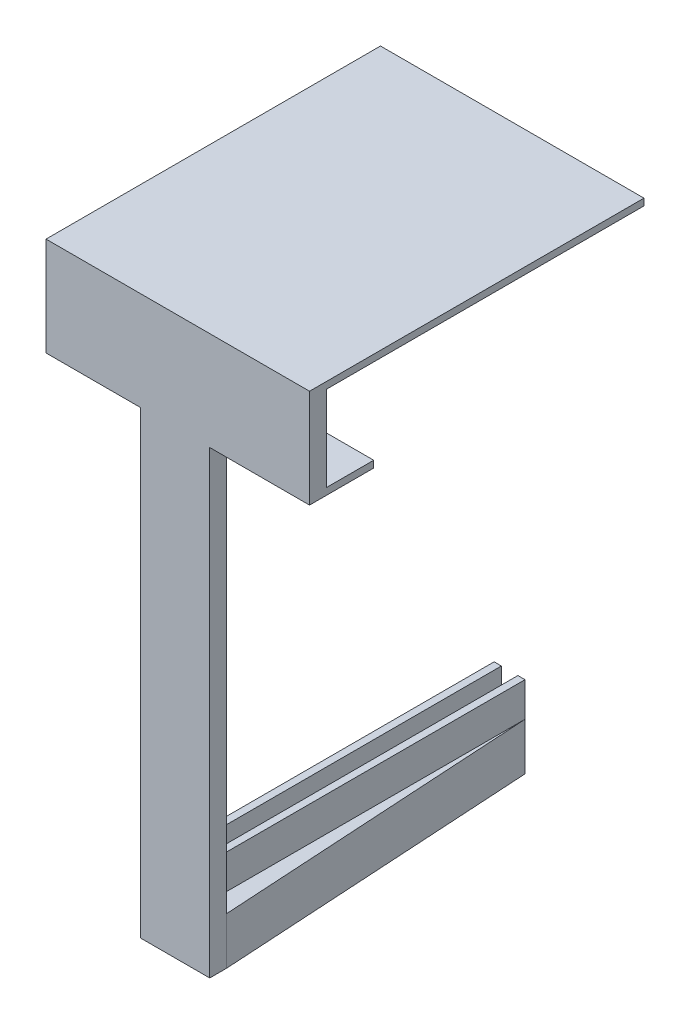
ISO-10303-21;
HEADER;
FILE_DESCRIPTION(('STEP AP214'),'2;1');
FILE_NAME('part.step','',(''),(''),'','','');
FILE_SCHEMA(('AUTOMOTIVE_DESIGN { 1 0 10303 214 1 1 1 1 }'));
ENDSEC;
DATA;
#1=APPLICATION_CONTEXT('core data for automotive mechanical design processes');
#2=APPLICATION_PROTOCOL_DEFINITION('international standard','automotive_design',2000,#1);
#3=PRODUCT_CONTEXT('',#1,'mechanical');
#4=PRODUCT('Part','Part','',(#3));
#5=PRODUCT_RELATED_PRODUCT_CATEGORY('part','',(#4));
#6=PRODUCT_DEFINITION_FORMATION('','',#4);
#7=PRODUCT_DEFINITION_CONTEXT('part definition',#1,'design');
#8=PRODUCT_DEFINITION('design','',#6,#7);
#9=PRODUCT_DEFINITION_SHAPE('','',#8);
#10=(LENGTH_UNIT() NAMED_UNIT(*) SI_UNIT(.MILLI.,.METRE.));
#11=(NAMED_UNIT(*) PLANE_ANGLE_UNIT() SI_UNIT($,.RADIAN.));
#12=(NAMED_UNIT(*) SI_UNIT($,.STERADIAN.) SOLID_ANGLE_UNIT());
#13=UNCERTAINTY_MEASURE_WITH_UNIT(LENGTH_MEASURE(1.E-05),#10,'distance_accuracy_value','');
#14=(GEOMETRIC_REPRESENTATION_CONTEXT(3) GLOBAL_UNCERTAINTY_ASSIGNED_CONTEXT((#13)) GLOBAL_UNIT_ASSIGNED_CONTEXT((#10,
#11,#12)) REPRESENTATION_CONTEXT('',''));
#15=CARTESIAN_POINT('',(0.,0.,0.));
#16=DIRECTION('',(0.,0.,1.));
#17=DIRECTION('',(1.,0.,0.));
#18=AXIS2_PLACEMENT_3D('',#15,#16,#17);
#19=CARTESIAN_POINT('',(4.72722504373343,-74.6,0.));
#20=DIRECTION('',(0.,0.,1.));
#21=DIRECTION('',(1.,0.,0.));
#22=AXIS2_PLACEMENT_3D('',#19,#20,#21);
#23=PLANE('',#22);
#24=DIRECTION('',(0.,1.,0.));
#25=VECTOR('',#24,1.);
#26=CARTESIAN_POINT('',(4.72722504373343,-74.6,0.));
#27=LINE('',#26,#25);
#28=CARTESIAN_POINT('',(4.72722504373343,-75.6,0.));
#29=VERTEX_POINT('',#28);
#30=CARTESIAN_POINT('',(4.72722504373343,-14.6,0.));
#31=VERTEX_POINT('',#30);
#32=EDGE_CURVE('E214',#29,#31,#27,.T.);
#33=ORIENTED_EDGE('',*,*,#32,.F.);
#34=DIRECTION('',(-1.,0.,0.));
#35=VECTOR('',#34,1.);
#36=CARTESIAN_POINT('',(1.89737662894614,-75.6,0.));
#37=LINE('',#36,#35);
#38=CARTESIAN_POINT('',(1.89737662894614,-75.6,0.));
#39=VERTEX_POINT('',#38);
#40=EDGE_CURVE('E797',#29,#39,#37,.T.);
#41=ORIENTED_EDGE('',*,*,#40,.T.);
#42=DIRECTION('',(0.,-1.,0.));
#43=VECTOR('',#42,1.);
#44=CARTESIAN_POINT('',(1.89737662894615,0.,0.));
#45=LINE('',#44,#43);
#46=CARTESIAN_POINT('',(1.89737662894614,-70.5226361769307,0.));
#47=VERTEX_POINT('',#46);
#48=EDGE_CURVE('E804',#47,#39,#45,.T.);
#49=ORIENTED_EDGE('',*,*,#48,.F.);
#50=DIRECTION('',(1.,0.,0.));
#51=VECTOR('',#50,1.);
#52=CARTESIAN_POINT('',(0.,-70.5226361769307,0.));
#53=LINE('',#52,#51);
#54=CARTESIAN_POINT('',(0.84132196452421,-70.5226361769307,0.));
#55=VERTEX_POINT('',#54);
#56=EDGE_CURVE('E812',#55,#47,#53,.T.);
#57=ORIENTED_EDGE('',*,*,#56,.F.);
#58=DIRECTION('',(0.,1.,0.));
#59=VECTOR('',#58,1.);
#60=CARTESIAN_POINT('',(0.84132196452421,0.,0.));
#61=LINE('',#60,#59);
#62=CARTESIAN_POINT('',(0.84132196452421,-82.6,0.));
#63=VERTEX_POINT('',#62);
#64=EDGE_CURVE('E811',#63,#55,#61,.T.);
#65=ORIENTED_EDGE('',*,*,#64,.F.);
#66=DIRECTION('',(1.,0.,0.));
#67=VECTOR('',#66,1.);
#68=CARTESIAN_POINT('',(4.72722504373343,-82.6,0.));
#69=LINE('',#68,#67);
#70=CARTESIAN_POINT('',(-1.60572431202152,-82.6,0.));
#71=VERTEX_POINT('',#70);
#72=EDGE_CURVE('E235',#71,#63,#69,.T.);
#73=ORIENTED_EDGE('',*,*,#72,.F.);
#74=DIRECTION('',(0.,1.,0.));
#75=VECTOR('',#74,1.);
#76=CARTESIAN_POINT('',(-1.60572431202152,0.,0.));
#77=LINE('',#76,#75);
#78=CARTESIAN_POINT('',(-1.60572431202152,-70.5226361769307,0.));
#79=VERTEX_POINT('',#78);
#80=EDGE_CURVE('E852',#71,#79,#77,.T.);
#81=ORIENTED_EDGE('',*,*,#80,.T.);
#82=DIRECTION('',(-1.,0.,0.));
#83=VECTOR('',#82,1.);
#84=CARTESIAN_POINT('',(0.,-70.5226361769307,0.));
#85=LINE('',#84,#83);
#86=CARTESIAN_POINT('',(-2.67694678700293,-70.5226361769307,0.));
#87=VERTEX_POINT('',#86);
#88=EDGE_CURVE('E857',#79,#87,#85,.T.);
#89=ORIENTED_EDGE('',*,*,#88,.T.);
#90=DIRECTION('',(0.,-1.,0.));
#91=VECTOR('',#90,1.);
#92=CARTESIAN_POINT('',(-2.67694678700293,0.,0.));
#93=LINE('',#92,#91);
#94=CARTESIAN_POINT('',(-2.67694678700293,-75.6,0.));
#95=VERTEX_POINT('',#94);
#96=EDGE_CURVE('E861',#87,#95,#93,.T.);
#97=ORIENTED_EDGE('',*,*,#96,.T.);
#98=DIRECTION('',(-1.,0.,0.));
#99=VECTOR('',#98,1.);
#100=CARTESIAN_POINT('',(-2.67694678700294,-75.6,0.));
#101=LINE('',#100,#99);
#102=CARTESIAN_POINT('',(-5.49162739123074,-75.6,0.));
#103=VERTEX_POINT('',#102);
#104=EDGE_CURVE('E67',#95,#103,#101,.T.);
#105=ORIENTED_EDGE('',*,*,#104,.T.);
#106=DIRECTION('',(0.,1.,0.));
#107=VECTOR('',#106,1.);
#108=CARTESIAN_POINT('',(-5.49162739123074,-74.6,0.));
#109=LINE('',#108,#107);
#110=CARTESIAN_POINT('',(-5.49162739123074,-14.6,0.));
#111=VERTEX_POINT('',#110);
#112=EDGE_CURVE('E213',#103,#111,#109,.T.);
#113=ORIENTED_EDGE('',*,*,#112,.T.);
#114=DIRECTION('',(1.,0.,0.));
#115=VECTOR('',#114,1.);
#116=CARTESIAN_POINT('',(4.72722504373343,-14.6,0.));
#117=LINE('',#116,#115);
#118=EDGE_CURVE('E252',#111,#31,#117,.T.);
#119=ORIENTED_EDGE('',*,*,#118,.T.);
#120=EDGE_LOOP('',(#33,#41,#49,#57,#65,#73,#81,#89,#97,#105,#113,#119));
#121=FACE_BOUND('',#120,.T.);
#122=ADVANCED_FACE('F49',(#121),#23,.F.);
#123=CARTESIAN_POINT('',(19.5,-13.6,0.));
#124=DIRECTION('',(0.,0.,1.));
#125=DIRECTION('',(1.,0.,0.));
#126=AXIS2_PLACEMENT_3D('',#123,#124,#125);
#127=PLANE('',#126);
#128=DIRECTION('',(1.,0.,0.));
#129=VECTOR('',#128,1.);
#130=CARTESIAN_POINT('',(19.5,-13.596261441228,0.));
#131=LINE('',#130,#129);
#132=CARTESIAN_POINT('',(-19.5,-13.596261441228,0.));
#133=VERTEX_POINT('',#132);
#134=CARTESIAN_POINT('',(19.5,-13.596261441228,0.));
#135=VERTEX_POINT('',#134);
#136=EDGE_CURVE('E269',#133,#135,#131,.T.);
#137=ORIENTED_EDGE('',*,*,#136,.F.);
#138=DIRECTION('',(0.,1.,0.));
#139=VECTOR('',#138,1.);
#140=CARTESIAN_POINT('',(-19.5,-13.6,0.));
#141=LINE('',#140,#139);
#142=CARTESIAN_POINT('',(-19.5,-1.,0.));
#143=VERTEX_POINT('',#142);
#144=EDGE_CURVE('E311',#133,#143,#141,.T.);
#145=ORIENTED_EDGE('',*,*,#144,.T.);
#146=DIRECTION('',(1.,0.,0.));
#147=VECTOR('',#146,1.);
#148=CARTESIAN_POINT('',(19.5,-1.,0.));
#149=LINE('',#148,#147);
#150=CARTESIAN_POINT('',(19.5,-1.,0.));
#151=VERTEX_POINT('',#150);
#152=EDGE_CURVE('E304',#143,#151,#149,.T.);
#153=ORIENTED_EDGE('',*,*,#152,.T.);
#154=DIRECTION('',(0.,1.,0.));
#155=VECTOR('',#154,1.);
#156=CARTESIAN_POINT('',(19.5,-13.6,0.));
#157=LINE('',#156,#155);
#158=EDGE_CURVE('E308',#135,#151,#157,.T.);
#159=ORIENTED_EDGE('',*,*,#158,.F.);
#160=EDGE_LOOP('',(#137,#145,#153,#159));
#161=FACE_BOUND('',#160,.T.);
#162=ADVANCED_FACE('F376',(#161),#127,.F.);
#163=CARTESIAN_POINT('',(0.,-1.,0.));
#164=DIRECTION('',(0.,1.,0.));
#165=DIRECTION('',(0.,0.,1.));
#166=AXIS2_PLACEMENT_3D('',#163,#164,#165);
#167=PLANE('',#166);
#168=ORIENTED_EDGE('',*,*,#152,.F.);
#169=DIRECTION('',(0.,0.,1.));
#170=VECTOR('',#169,1.);
#171=CARTESIAN_POINT('',(-19.5,-1.,0.));
#172=LINE('',#171,#170);
#173=CARTESIAN_POINT('',(-19.5,-1.,-47.));
#174=VERTEX_POINT('',#173);
#175=EDGE_CURVE('E11',#174,#143,#172,.T.);
#176=ORIENTED_EDGE('',*,*,#175,.F.);
#177=DIRECTION('',(1.,0.,0.));
#178=VECTOR('',#177,1.);
#179=CARTESIAN_POINT('',(-19.5,-1.,-47.));
#180=LINE('',#179,#178);
#181=CARTESIAN_POINT('',(19.5,-1.,-47.));
#182=VERTEX_POINT('',#181);
#183=EDGE_CURVE('E334',#174,#182,#180,.T.);
#184=ORIENTED_EDGE('',*,*,#183,.T.);
#185=DIRECTION('',(0.,0.,-1.));
#186=VECTOR('',#185,1.);
#187=CARTESIAN_POINT('',(19.5,-1.,0.));
#188=LINE('',#187,#186);
#189=EDGE_CURVE('E59',#151,#182,#188,.T.);
#190=ORIENTED_EDGE('',*,*,#189,.F.);
#191=EDGE_LOOP('',(#168,#176,#184,#190));
#192=FACE_BOUND('',#191,.T.);
#193=ADVANCED_FACE('F380',(#192),#167,.F.);
#194=CARTESIAN_POINT('',(0.,0.,2.5));
#195=DIRECTION('',(0.,0.,1.));
#196=DIRECTION('',(1.,0.,0.));
#197=AXIS2_PLACEMENT_3D('',#194,#195,#196);
#198=PLANE('',#197);
#199=DIRECTION('',(-1.,0.,0.));
#200=VECTOR('',#199,1.);
#201=CARTESIAN_POINT('',(19.5,0.,2.5));
#202=LINE('',#201,#200);
#203=CARTESIAN_POINT('',(19.5,0.,2.5));
#204=VERTEX_POINT('',#203);
#205=CARTESIAN_POINT('',(-19.5,0.,2.5));
#206=VERTEX_POINT('',#205);
#207=EDGE_CURVE('E314',#204,#206,#202,.T.);
#208=ORIENTED_EDGE('',*,*,#207,.T.);
#209=DIRECTION('',(0.,-1.,0.));
#210=VECTOR('',#209,1.);
#211=CARTESIAN_POINT('',(-19.5,0.,2.5));
#212=LINE('',#211,#210);
#213=CARTESIAN_POINT('',(-19.5,-14.6,2.5));
#214=VERTEX_POINT('',#213);
#215=EDGE_CURVE('E318',#206,#214,#212,.T.);
#216=ORIENTED_EDGE('',*,*,#215,.T.);
#217=DIRECTION('',(-1.,0.,0.));
#218=VECTOR('',#217,1.);
#219=CARTESIAN_POINT('',(19.5,-14.6,2.5));
#220=LINE('',#219,#218);
#221=CARTESIAN_POINT('',(-5.49162739123074,-14.6,2.5));
#222=VERTEX_POINT('',#221);
#223=EDGE_CURVE('E293',#222,#214,#220,.T.);
#224=ORIENTED_EDGE('',*,*,#223,.F.);
#225=DIRECTION('',(0.,1.,0.));
#226=VECTOR('',#225,1.);
#227=CARTESIAN_POINT('',(-5.49162739123074,-74.6,2.5));
#228=LINE('',#227,#226);
#229=CARTESIAN_POINT('',(-5.49162739123074,-82.6,2.5));
#230=VERTEX_POINT('',#229);
#231=EDGE_CURVE('E259',#230,#222,#228,.T.);
#232=ORIENTED_EDGE('',*,*,#231,.F.);
#233=DIRECTION('',(-1.,0.,0.));
#234=VECTOR('',#233,1.);
#235=CARTESIAN_POINT('',(-5.49162739123074,-82.6,2.5));
#236=LINE('',#235,#234);
#237=CARTESIAN_POINT('',(4.72722504373343,-82.6,2.5));
#238=VERTEX_POINT('',#237);
#239=EDGE_CURVE('E234',#238,#230,#236,.T.);
#240=ORIENTED_EDGE('',*,*,#239,.F.);
#241=DIRECTION('',(0.,1.,0.));
#242=VECTOR('',#241,1.);
#243=CARTESIAN_POINT('',(4.72722504373343,-74.6,2.5));
#244=LINE('',#243,#242);
#245=CARTESIAN_POINT('',(4.72722504373343,-14.6,2.5));
#246=VERTEX_POINT('',#245);
#247=EDGE_CURVE('E232',#238,#246,#244,.T.);
#248=ORIENTED_EDGE('',*,*,#247,.T.);
#249=CARTESIAN_POINT('',(19.5,-14.6,2.5));
#250=VERTEX_POINT('',#249);
#251=EDGE_CURVE('E294',#250,#246,#220,.T.);
#252=ORIENTED_EDGE('',*,*,#251,.F.);
#253=DIRECTION('',(0.,1.,0.));
#254=VECTOR('',#253,1.);
#255=CARTESIAN_POINT('',(19.5,-1.,2.5));
#256=LINE('',#255,#254);
#257=EDGE_CURVE('E322',#250,#204,#256,.T.);
#258=ORIENTED_EDGE('',*,*,#257,.T.);
#259=EDGE_LOOP('',(#208,#216,#224,#232,#240,#248,#252,#258));
#260=FACE_BOUND('',#259,.T.);
#261=ADVANCED_FACE('F358',(#260),#198,.T.);
#262=CARTESIAN_POINT('',(19.5,-1.,0.));
#263=DIRECTION('',(1.,0.,0.));
#264=DIRECTION('',(0.,0.,-1.));
#265=AXIS2_PLACEMENT_3D('',#262,#263,#264);
#266=PLANE('',#265);
#267=DIRECTION('',(0.,0.,-1.));
#268=VECTOR('',#267,1.);
#269=CARTESIAN_POINT('',(19.5,0.,0.));
#270=LINE('',#269,#268);
#271=CARTESIAN_POINT('',(19.5,0.,-47.));
#272=VERTEX_POINT('',#271);
#273=EDGE_CURVE('E342',#204,#272,#270,.T.);
#274=ORIENTED_EDGE('',*,*,#273,.F.);
#275=ORIENTED_EDGE('',*,*,#257,.F.);
#276=DIRECTION('',(0.,0.,1.));
#277=VECTOR('',#276,1.);
#278=CARTESIAN_POINT('',(19.5,-14.6,0.));
#279=LINE('',#278,#277);
#280=CARTESIAN_POINT('',(19.5,-14.6,-7.));
#281=VERTEX_POINT('',#280);
#282=EDGE_CURVE('E300',#281,#250,#279,.T.);
#283=ORIENTED_EDGE('',*,*,#282,.F.);
#284=DIRECTION('',(0.,-1.,0.));
#285=VECTOR('',#284,1.);
#286=CARTESIAN_POINT('',(19.5,-14.6,-7.));
#287=LINE('',#286,#285);
#288=CARTESIAN_POINT('',(19.5,-13.596261441228,-7.));
#289=VERTEX_POINT('',#288);
#290=EDGE_CURVE('E280',#289,#281,#287,.T.);
#291=ORIENTED_EDGE('',*,*,#290,.F.);
#292=DIRECTION('',(0.,0.,1.));
#293=VECTOR('',#292,1.);
#294=CARTESIAN_POINT('',(19.5,-13.596261441228,-7.));
#295=LINE('',#294,#293);
#296=EDGE_CURVE('E284',#289,#135,#295,.T.);
#297=ORIENTED_EDGE('',*,*,#296,.T.);
#298=ORIENTED_EDGE('',*,*,#158,.T.);
#299=ORIENTED_EDGE('',*,*,#189,.T.);
#300=DIRECTION('',(0.,1.,0.));
#301=VECTOR('',#300,1.);
#302=CARTESIAN_POINT('',(19.5,-1.,-47.));
#303=LINE('',#302,#301);
#304=EDGE_CURVE('E338',#182,#272,#303,.T.);
#305=ORIENTED_EDGE('',*,*,#304,.T.);
#306=EDGE_LOOP('',(#274,#275,#283,#291,#297,#298,#299,#305));
#307=FACE_BOUND('',#306,.T.);
#308=ADVANCED_FACE('F51',(#307),#266,.T.);
#309=CARTESIAN_POINT('',(-19.5,-1.,0.));
#310=DIRECTION('',(-1.,0.,0.));
#311=DIRECTION('',(0.,0.,1.));
#312=AXIS2_PLACEMENT_3D('',#309,#310,#311);
#313=PLANE('',#312);
#314=DIRECTION('',(0.,0.,1.));
#315=VECTOR('',#314,1.);
#316=CARTESIAN_POINT('',(-19.5,0.,0.));
#317=LINE('',#316,#315);
#318=CARTESIAN_POINT('',(-19.5,0.,-47.));
#319=VERTEX_POINT('',#318);
#320=EDGE_CURVE('E53',#319,#206,#317,.T.);
#321=ORIENTED_EDGE('',*,*,#320,.F.);
#322=DIRECTION('',(0.,-1.,0.));
#323=VECTOR('',#322,1.);
#324=CARTESIAN_POINT('',(-19.5,0.,-47.));
#325=LINE('',#324,#323);
#326=EDGE_CURVE('E330',#319,#174,#325,.T.);
#327=ORIENTED_EDGE('',*,*,#326,.T.);
#328=ORIENTED_EDGE('',*,*,#175,.T.);
#329=ORIENTED_EDGE('',*,*,#144,.F.);
#330=DIRECTION('',(0.,0.,1.));
#331=VECTOR('',#330,1.);
#332=CARTESIAN_POINT('',(-19.5,-13.596261441228,-7.));
#333=LINE('',#332,#331);
#334=CARTESIAN_POINT('',(-19.5,-13.596261441228,-7.));
#335=VERTEX_POINT('',#334);
#336=EDGE_CURVE('E290',#335,#133,#333,.T.);
#337=ORIENTED_EDGE('',*,*,#336,.F.);
#338=DIRECTION('',(0.,1.,0.));
#339=VECTOR('',#338,1.);
#340=CARTESIAN_POINT('',(-19.5,-13.596261441228,-7.));
#341=LINE('',#340,#339);
#342=CARTESIAN_POINT('',(-19.5,-14.6,-7.));
#343=VERTEX_POINT('',#342);
#344=EDGE_CURVE('E274',#343,#335,#341,.T.);
#345=ORIENTED_EDGE('',*,*,#344,.F.);
#346=DIRECTION('',(0.,0.,-1.));
#347=VECTOR('',#346,1.);
#348=CARTESIAN_POINT('',(-19.5,-14.6,2.5));
#349=LINE('',#348,#347);
#350=EDGE_CURVE('E297',#214,#343,#349,.T.);
#351=ORIENTED_EDGE('',*,*,#350,.F.);
#352=ORIENTED_EDGE('',*,*,#215,.F.);
#353=EDGE_LOOP('',(#321,#327,#328,#329,#337,#345,#351,#352));
#354=FACE_BOUND('',#353,.T.);
#355=ADVANCED_FACE('F354',(#354),#313,.T.);
#356=CARTESIAN_POINT('',(0.,0.,0.));
#357=DIRECTION('',(0.,1.,0.));
#358=DIRECTION('',(0.,0.,1.));
#359=AXIS2_PLACEMENT_3D('',#356,#357,#358);
#360=PLANE('',#359);
#361=DIRECTION('',(-1.,0.,0.));
#362=VECTOR('',#361,1.);
#363=CARTESIAN_POINT('',(19.5,0.,-47.));
#364=LINE('',#363,#362);
#365=EDGE_CURVE('E326',#272,#319,#364,.T.);
#366=ORIENTED_EDGE('',*,*,#365,.T.);
#367=ORIENTED_EDGE('',*,*,#320,.T.);
#368=ORIENTED_EDGE('',*,*,#207,.F.);
#369=ORIENTED_EDGE('',*,*,#273,.T.);
#370=EDGE_LOOP('',(#366,#367,#368,#369));
#371=FACE_BOUND('',#370,.T.);
#372=ADVANCED_FACE('F350',(#371),#360,.T.);
#373=CARTESIAN_POINT('',(0.,0.,-47.));
#374=DIRECTION('',(0.,0.,1.));
#375=DIRECTION('',(1.,0.,0.));
#376=AXIS2_PLACEMENT_3D('',#373,#374,#375);
#377=PLANE('',#376);
#378=ORIENTED_EDGE('',*,*,#365,.F.);
#379=ORIENTED_EDGE('',*,*,#304,.F.);
#380=ORIENTED_EDGE('',*,*,#183,.F.);
#381=ORIENTED_EDGE('',*,*,#326,.F.);
#382=EDGE_LOOP('',(#378,#379,#380,#381));
#383=FACE_BOUND('',#382,.T.);
#384=ADVANCED_FACE('F383',(#383),#377,.F.);
#385=CARTESIAN_POINT('',(0.,-14.6,0.));
#386=DIRECTION('',(0.,-1.,0.));
#387=DIRECTION('',(0.,0.,-1.));
#388=AXIS2_PLACEMENT_3D('',#385,#386,#387);
#389=PLANE('',#388);
#390=DIRECTION('',(0.,0.,-1.));
#391=VECTOR('',#390,1.);
#392=CARTESIAN_POINT('',(-5.49162739123074,-14.6,0.));
#393=LINE('',#392,#391);
#394=EDGE_CURVE('E248',#222,#111,#393,.T.);
#395=ORIENTED_EDGE('',*,*,#394,.F.);
#396=ORIENTED_EDGE('',*,*,#223,.T.);
#397=ORIENTED_EDGE('',*,*,#350,.T.);
#398=DIRECTION('',(-1.,0.,0.));
#399=VECTOR('',#398,1.);
#400=CARTESIAN_POINT('',(-19.5,-14.6,-7.));
#401=LINE('',#400,#399);
#402=EDGE_CURVE('E270',#281,#343,#401,.T.);
#403=ORIENTED_EDGE('',*,*,#402,.F.);
#404=ORIENTED_EDGE('',*,*,#282,.T.);
#405=ORIENTED_EDGE('',*,*,#251,.T.);
#406=DIRECTION('',(0.,0.,1.));
#407=VECTOR('',#406,1.);
#408=CARTESIAN_POINT('',(4.72722504373343,-14.6,2.5));
#409=LINE('',#408,#407);
#410=EDGE_CURVE('E256',#31,#246,#409,.T.);
#411=ORIENTED_EDGE('',*,*,#410,.F.);
#412=ORIENTED_EDGE('',*,*,#118,.F.);
#413=EDGE_LOOP('',(#395,#396,#397,#403,#404,#405,#411,#412));
#414=FACE_BOUND('',#413,.T.);
#415=ADVANCED_FACE('F364',(#414),#389,.T.);
#416=CARTESIAN_POINT('',(19.5,-13.596261441228,-7.));
#417=DIRECTION('',(0.,-1.,0.));
#418=DIRECTION('',(0.,0.,-1.));
#419=AXIS2_PLACEMENT_3D('',#416,#417,#418);
#420=PLANE('',#419);
#421=ORIENTED_EDGE('',*,*,#136,.T.);
#422=ORIENTED_EDGE('',*,*,#296,.F.);
#423=DIRECTION('',(1.,0.,0.));
#424=VECTOR('',#423,1.);
#425=CARTESIAN_POINT('',(19.5,-13.596261441228,-7.));
#426=LINE('',#425,#424);
#427=EDGE_CURVE('E277',#335,#289,#426,.T.);
#428=ORIENTED_EDGE('',*,*,#427,.F.);
#429=ORIENTED_EDGE('',*,*,#336,.T.);
#430=EDGE_LOOP('',(#421,#422,#428,#429));
#431=FACE_BOUND('',#430,.T.);
#432=ADVANCED_FACE('F391',(#431),#420,.F.);
#433=CARTESIAN_POINT('',(0.,0.,-7.));
#434=DIRECTION('',(0.,0.,1.));
#435=DIRECTION('',(1.,0.,0.));
#436=AXIS2_PLACEMENT_3D('',#433,#434,#435);
#437=PLANE('',#436);
#438=ORIENTED_EDGE('',*,*,#402,.T.);
#439=ORIENTED_EDGE('',*,*,#344,.T.);
#440=ORIENTED_EDGE('',*,*,#427,.T.);
#441=ORIENTED_EDGE('',*,*,#290,.T.);
#442=EDGE_LOOP('',(#438,#439,#440,#441));
#443=FACE_BOUND('',#442,.T.);
#444=ADVANCED_FACE('F367',(#443),#437,.F.);
#445=CARTESIAN_POINT('',(-5.49162739123074,-74.6,0.));
#446=DIRECTION('',(1.,0.,0.));
#447=DIRECTION('',(0.,0.,-1.));
#448=AXIS2_PLACEMENT_3D('',#445,#446,#447);
#449=PLANE('',#448);
#450=ORIENTED_EDGE('',*,*,#394,.T.);
#451=ORIENTED_EDGE('',*,*,#112,.F.);
#452=CARTESIAN_POINT('',(-5.49162739123074,-82.6,0.));
#453=VERTEX_POINT('',#452);
#454=EDGE_CURVE('E265',#453,#103,#109,.T.);
#455=ORIENTED_EDGE('',*,*,#454,.F.);
#456=DIRECTION('',(0.,0.,-1.));
#457=VECTOR('',#456,1.);
#458=CARTESIAN_POINT('',(-5.49162739123074,-82.6,0.));
#459=LINE('',#458,#457);
#460=EDGE_CURVE('E239',#230,#453,#459,.T.);
#461=ORIENTED_EDGE('',*,*,#460,.F.);
#462=ORIENTED_EDGE('',*,*,#231,.T.);
#463=EDGE_LOOP('',(#450,#451,#455,#461,#462));
#464=FACE_BOUND('',#463,.T.);
#465=ADVANCED_FACE('F406',(#464),#449,.F.);
#466=CARTESIAN_POINT('',(4.72722504373343,-74.6,2.5));
#467=DIRECTION('',(-1.,0.,0.));
#468=DIRECTION('',(0.,0.,1.));
#469=AXIS2_PLACEMENT_3D('',#466,#467,#468);
#470=PLANE('',#469);
#471=ORIENTED_EDGE('',*,*,#410,.T.);
#472=ORIENTED_EDGE('',*,*,#247,.F.);
#473=DIRECTION('',(0.,0.,1.));
#474=VECTOR('',#473,1.);
#475=CARTESIAN_POINT('',(4.72722504373343,-82.6,2.5));
#476=LINE('',#475,#474);
#477=CARTESIAN_POINT('',(4.72722504373343,-82.6,0.));
#478=VERTEX_POINT('',#477);
#479=EDGE_CURVE('E221',#478,#238,#476,.T.);
#480=ORIENTED_EDGE('',*,*,#479,.F.);
#481=EDGE_CURVE('E202',#478,#29,#27,.T.);
#482=ORIENTED_EDGE('',*,*,#481,.T.);
#483=ORIENTED_EDGE('',*,*,#32,.T.);
#484=EDGE_LOOP('',(#471,#472,#480,#482,#483));
#485=FACE_BOUND('',#484,.T.);
#486=ADVANCED_FACE('F230',(#485),#470,.F.);
#487=CARTESIAN_POINT('',(0.,-82.6,0.));
#488=DIRECTION('',(0.,1.,0.));
#489=DIRECTION('',(0.,0.,1.));
#490=AXIS2_PLACEMENT_3D('',#487,#488,#489);
#491=PLANE('',#490);
#492=DIRECTION('',(0.0601007010978515,0.,0.99819231900849));
#493=VECTOR('',#492,1.);
#494=CARTESIAN_POINT('',(4.72722504373343,-82.6,0.));
#495=LINE('',#494,#493);
#496=CARTESIAN_POINT('',(1.89737662894614,-82.6,-47.));
#497=VERTEX_POINT('',#496);
#498=EDGE_CURVE('E205',#497,#478,#495,.T.);
#499=ORIENTED_EDGE('',*,*,#498,.T.);
#500=ORIENTED_EDGE('',*,*,#479,.T.);
#501=ORIENTED_EDGE('',*,*,#239,.T.);
#502=ORIENTED_EDGE('',*,*,#460,.T.);
#503=DIRECTION('',(0.0597797193785499,0.,-0.998211593376385));
#504=VECTOR('',#503,1.);
#505=CARTESIAN_POINT('',(-5.49162739123074,-82.6,0.));
#506=LINE('',#505,#504);
#507=CARTESIAN_POINT('',(-2.67694678700294,-82.6,-47.));
#508=VERTEX_POINT('',#507);
#509=EDGE_CURVE('E226',#453,#508,#506,.T.);
#510=ORIENTED_EDGE('',*,*,#509,.T.);
#511=DIRECTION('',(-1.,0.,0.));
#512=VECTOR('',#511,1.);
#513=CARTESIAN_POINT('',(0.,-82.6,-47.));
#514=LINE('',#513,#512);
#515=CARTESIAN_POINT('',(-1.60572431202152,-82.6,-47.));
#516=VERTEX_POINT('',#515);
#517=EDGE_CURVE('E851',#516,#508,#514,.T.);
#518=ORIENTED_EDGE('',*,*,#517,.F.);
#519=DIRECTION('',(0.,0.,1.));
#520=VECTOR('',#519,1.);
#521=CARTESIAN_POINT('',(-1.60572431202152,-82.6,-47.));
#522=LINE('',#521,#520);
#523=EDGE_CURVE('E847',#516,#71,#522,.T.);
#524=ORIENTED_EDGE('',*,*,#523,.T.);
#525=ORIENTED_EDGE('',*,*,#72,.T.);
#526=DIRECTION('',(0.,0.,1.));
#527=VECTOR('',#526,1.);
#528=CARTESIAN_POINT('',(0.84132196452421,-82.6,-47.));
#529=LINE('',#528,#527);
#530=CARTESIAN_POINT('',(0.84132196452421,-82.6,-47.));
#531=VERTEX_POINT('',#530);
#532=EDGE_CURVE('E826',#531,#63,#529,.T.);
#533=ORIENTED_EDGE('',*,*,#532,.F.);
#534=DIRECTION('',(-1.,0.,0.));
#535=VECTOR('',#534,1.);
#536=CARTESIAN_POINT('',(0.,-82.6,-47.));
#537=LINE('',#536,#535);
#538=EDGE_CURVE('E224',#497,#531,#537,.T.);
#539=ORIENTED_EDGE('',*,*,#538,.F.);
#540=EDGE_LOOP('',(#499,#500,#501,#502,#510,#518,#524,#525,#533,#539));
#541=FACE_BOUND('',#540,.T.);
#542=ADVANCED_FACE('F219',(#541),#491,.F.);
#543=CARTESIAN_POINT('',(0.,-70.5226361769307,-47.));
#544=DIRECTION('',(0.,-1.,0.));
#545=DIRECTION('',(0.,0.,-1.));
#546=AXIS2_PLACEMENT_3D('',#543,#544,#545);
#547=PLANE('',#546);
#548=ORIENTED_EDGE('',*,*,#56,.T.);
#549=DIRECTION('',(0.,0.,1.));
#550=VECTOR('',#549,1.);
#551=CARTESIAN_POINT('',(1.89737662894614,-70.5226361769307,-47.));
#552=LINE('',#551,#550);
#553=CARTESIAN_POINT('',(1.89737662894614,-70.5226361769307,-47.));
#554=VERTEX_POINT('',#553);
#555=EDGE_CURVE('E241',#554,#47,#552,.T.);
#556=ORIENTED_EDGE('',*,*,#555,.F.);
#557=DIRECTION('',(1.,0.,0.));
#558=VECTOR('',#557,1.);
#559=CARTESIAN_POINT('',(0.,-70.5226361769307,-47.));
#560=LINE('',#559,#558);
#561=CARTESIAN_POINT('',(0.84132196452421,-70.5226361769307,-47.));
#562=VERTEX_POINT('',#561);
#563=EDGE_CURVE('E816',#562,#554,#560,.T.);
#564=ORIENTED_EDGE('',*,*,#563,.F.);
#565=DIRECTION('',(0.,0.,1.));
#566=VECTOR('',#565,1.);
#567=CARTESIAN_POINT('',(0.84132196452421,-70.5226361769307,-47.));
#568=LINE('',#567,#566);
#569=EDGE_CURVE('E822',#562,#55,#568,.T.);
#570=ORIENTED_EDGE('',*,*,#569,.T.);
#571=EDGE_LOOP('',(#548,#556,#564,#570));
#572=FACE_BOUND('',#571,.T.);
#573=ADVANCED_FACE('F476',(#572),#547,.F.);
#574=CARTESIAN_POINT('',(1.89737662894615,0.,-47.));
#575=DIRECTION('',(-1.,0.,0.));
#576=DIRECTION('',(0.,-1.,0.));
#577=AXIS2_PLACEMENT_3D('',#574,#575,#576);
#578=PLANE('',#577);
#579=ORIENTED_EDGE('',*,*,#48,.T.);
#580=DIRECTION('',(0.,0.,-1.));
#581=VECTOR('',#580,1.);
#582=CARTESIAN_POINT('',(1.89737662894614,-75.6,-47.));
#583=LINE('',#582,#581);
#584=CARTESIAN_POINT('',(1.89737662894614,-75.6,-47.));
#585=VERTEX_POINT('',#584);
#586=EDGE_CURVE('E227',#39,#585,#583,.T.);
#587=ORIENTED_EDGE('',*,*,#586,.T.);
#588=DIRECTION('',(0.,-1.,0.));
#589=VECTOR('',#588,1.);
#590=CARTESIAN_POINT('',(1.89737662894615,0.,-47.));
#591=LINE('',#590,#589);
#592=EDGE_CURVE('E834',#554,#585,#591,.T.);
#593=ORIENTED_EDGE('',*,*,#592,.F.);
#594=ORIENTED_EDGE('',*,*,#555,.T.);
#595=EDGE_LOOP('',(#579,#587,#593,#594));
#596=FACE_BOUND('',#595,.T.);
#597=ADVANCED_FACE('F485',(#596),#578,.F.);
#598=CARTESIAN_POINT('',(0.84132196452421,0.,-47.));
#599=DIRECTION('',(1.,0.,0.));
#600=DIRECTION('',(0.,0.,-1.));
#601=AXIS2_PLACEMENT_3D('',#598,#599,#600);
#602=PLANE('',#601);
#603=ORIENTED_EDGE('',*,*,#64,.T.);
#604=ORIENTED_EDGE('',*,*,#569,.F.);
#605=DIRECTION('',(0.,1.,0.));
#606=VECTOR('',#605,1.);
#607=CARTESIAN_POINT('',(0.84132196452421,0.,-47.));
#608=LINE('',#607,#606);
#609=EDGE_CURVE('E827',#531,#562,#608,.T.);
#610=ORIENTED_EDGE('',*,*,#609,.F.);
#611=ORIENTED_EDGE('',*,*,#532,.T.);
#612=EDGE_LOOP('',(#603,#604,#610,#611));
#613=FACE_BOUND('',#612,.T.);
#614=ADVANCED_FACE('F495',(#613),#602,.F.);
#615=CARTESIAN_POINT('',(0.,0.,-47.));
#616=DIRECTION('',(0.,0.,-1.));
#617=DIRECTION('',(-1.,0.,0.));
#618=AXIS2_PLACEMENT_3D('',#615,#616,#617);
#619=PLANE('',#618);
#620=ORIENTED_EDGE('',*,*,#563,.T.);
#621=ORIENTED_EDGE('',*,*,#592,.T.);
#622=DIRECTION('',(0.,-1.,0.));
#623=VECTOR('',#622,1.);
#624=CARTESIAN_POINT('',(1.89737662894614,-75.6,-47.));
#625=LINE('',#624,#623);
#626=EDGE_CURVE('E806',#585,#497,#625,.T.);
#627=ORIENTED_EDGE('',*,*,#626,.T.);
#628=ORIENTED_EDGE('',*,*,#538,.T.);
#629=ORIENTED_EDGE('',*,*,#609,.T.);
#630=EDGE_LOOP('',(#620,#621,#627,#628,#629));
#631=FACE_BOUND('',#630,.T.);
#632=ADVANCED_FACE('F505',(#631),#619,.T.);
#633=CARTESIAN_POINT('',(-2.67694678700293,0.,-47.));
#634=DIRECTION('',(-1.,0.,0.));
#635=DIRECTION('',(0.,-1.,0.));
#636=AXIS2_PLACEMENT_3D('',#633,#634,#635);
#637=PLANE('',#636);
#638=DIRECTION('',(0.,0.,1.));
#639=VECTOR('',#638,1.);
#640=CARTESIAN_POINT('',(-2.67694678700294,-75.6,-47.));
#641=LINE('',#640,#639);
#642=CARTESIAN_POINT('',(-2.67694678700293,-75.6,-47.));
#643=VERTEX_POINT('',#642);
#644=EDGE_CURVE('E75',#643,#95,#641,.T.);
#645=ORIENTED_EDGE('',*,*,#644,.T.);
#646=ORIENTED_EDGE('',*,*,#96,.F.);
#647=DIRECTION('',(0.,0.,1.));
#648=VECTOR('',#647,1.);
#649=CARTESIAN_POINT('',(-2.67694678700293,-70.5226361769307,-47.));
#650=LINE('',#649,#648);
#651=CARTESIAN_POINT('',(-2.67694678700293,-70.5226361769307,-47.));
#652=VERTEX_POINT('',#651);
#653=EDGE_CURVE('E818',#652,#87,#650,.T.);
#654=ORIENTED_EDGE('',*,*,#653,.F.);
#655=DIRECTION('',(0.,-1.,0.));
#656=VECTOR('',#655,1.);
#657=CARTESIAN_POINT('',(-2.67694678700293,0.,-47.));
#658=LINE('',#657,#656);
#659=EDGE_CURVE('E856',#652,#643,#658,.T.);
#660=ORIENTED_EDGE('',*,*,#659,.T.);
#661=EDGE_LOOP('',(#645,#646,#654,#660));
#662=FACE_BOUND('',#661,.T.);
#663=ADVANCED_FACE('F515',(#662),#637,.T.);
#664=CARTESIAN_POINT('',(0.,-70.5226361769307,-47.));
#665=DIRECTION('',(0.,1.,0.));
#666=DIRECTION('',(0.,0.,1.));
#667=AXIS2_PLACEMENT_3D('',#664,#665,#666);
#668=PLANE('',#667);
#669=ORIENTED_EDGE('',*,*,#88,.F.);
#670=DIRECTION('',(0.,0.,1.));
#671=VECTOR('',#670,1.);
#672=CARTESIAN_POINT('',(-1.60572431202152,-70.5226361769307,-47.));
#673=LINE('',#672,#671);
#674=CARTESIAN_POINT('',(-1.60572431202152,-70.5226361769307,-47.));
#675=VERTEX_POINT('',#674);
#676=EDGE_CURVE('E844',#675,#79,#673,.T.);
#677=ORIENTED_EDGE('',*,*,#676,.F.);
#678=DIRECTION('',(-1.,0.,0.));
#679=VECTOR('',#678,1.);
#680=CARTESIAN_POINT('',(0.,-70.5226361769307,-47.));
#681=LINE('',#680,#679);
#682=EDGE_CURVE('E871',#675,#652,#681,.T.);
#683=ORIENTED_EDGE('',*,*,#682,.T.);
#684=ORIENTED_EDGE('',*,*,#653,.T.);
#685=EDGE_LOOP('',(#669,#677,#683,#684));
#686=FACE_BOUND('',#685,.T.);
#687=ADVANCED_FACE('F525',(#686),#668,.T.);
#688=CARTESIAN_POINT('',(-1.60572431202152,0.,-47.));
#689=DIRECTION('',(1.,0.,0.));
#690=DIRECTION('',(0.,0.,-1.));
#691=AXIS2_PLACEMENT_3D('',#688,#689,#690);
#692=PLANE('',#691);
#693=ORIENTED_EDGE('',*,*,#80,.F.);
#694=ORIENTED_EDGE('',*,*,#523,.F.);
#695=DIRECTION('',(0.,1.,0.));
#696=VECTOR('',#695,1.);
#697=CARTESIAN_POINT('',(-1.60572431202152,0.,-47.));
#698=LINE('',#697,#696);
#699=EDGE_CURVE('E867',#516,#675,#698,.T.);
#700=ORIENTED_EDGE('',*,*,#699,.T.);
#701=ORIENTED_EDGE('',*,*,#676,.T.);
#702=EDGE_LOOP('',(#693,#694,#700,#701));
#703=FACE_BOUND('',#702,.T.);
#704=ADVANCED_FACE('F534',(#703),#692,.T.);
#705=CARTESIAN_POINT('',(0.,0.,-47.));
#706=DIRECTION('',(0.,0.,-1.));
#707=DIRECTION('',(-1.,0.,0.));
#708=AXIS2_PLACEMENT_3D('',#705,#706,#707);
#709=PLANE('',#708);
#710=ORIENTED_EDGE('',*,*,#659,.F.);
#711=ORIENTED_EDGE('',*,*,#682,.F.);
#712=ORIENTED_EDGE('',*,*,#699,.F.);
#713=ORIENTED_EDGE('',*,*,#517,.T.);
#714=DIRECTION('',(0.,-1.,0.));
#715=VECTOR('',#714,1.);
#716=CARTESIAN_POINT('',(-2.67694678700294,-75.6,-47.));
#717=LINE('',#716,#715);
#718=EDGE_CURVE('E864',#643,#508,#717,.T.);
#719=ORIENTED_EDGE('',*,*,#718,.F.);
#720=EDGE_LOOP('',(#710,#711,#712,#713,#719));
#721=FACE_BOUND('',#720,.T.);
#722=ADVANCED_FACE('F544',(#721),#709,.T.);
#723=CARTESIAN_POINT('',(-5.49162739123074,-75.6,0.));
#724=DIRECTION('',(-0.998211593376385,0.,-0.0597797193785499));
#725=DIRECTION('',(-0.0597797193785499,0.,0.998211593376385));
#726=AXIS2_PLACEMENT_3D('',#723,#724,#725);
#727=PLANE('',#726);
#728=ORIENTED_EDGE('',*,*,#509,.F.);
#729=ORIENTED_EDGE('',*,*,#454,.T.);
#730=DIRECTION('',(0.0597797193785499,0.,-0.998211593376385));
#731=VECTOR('',#730,1.);
#732=CARTESIAN_POINT('',(-5.49162739123074,-75.6,0.));
#733=LINE('',#732,#731);
#734=EDGE_CURVE('E885',#103,#643,#733,.T.);
#735=ORIENTED_EDGE('',*,*,#734,.T.);
#736=ORIENTED_EDGE('',*,*,#718,.T.);
#737=EDGE_LOOP('',(#728,#729,#735,#736));
#738=FACE_BOUND('',#737,.T.);
#739=ADVANCED_FACE('F553',(#738),#727,.T.);
#740=CARTESIAN_POINT('',(0.,-75.6,0.));
#741=DIRECTION('',(0.,1.,0.));
#742=DIRECTION('',(0.,0.,1.));
#743=AXIS2_PLACEMENT_3D('',#740,#741,#742);
#744=PLANE('',#743);
#745=ORIENTED_EDGE('',*,*,#104,.F.);
#746=ORIENTED_EDGE('',*,*,#644,.F.);
#747=ORIENTED_EDGE('',*,*,#734,.F.);
#748=EDGE_LOOP('',(#745,#746,#747));
#749=FACE_BOUND('',#748,.T.);
#750=ADVANCED_FACE('F563',(#749),#744,.T.);
#751=CARTESIAN_POINT('',(4.72722504373343,-75.6,0.));
#752=DIRECTION('',(0.99819231900849,0.,-0.0601007010978514));
#753=DIRECTION('',(-0.0601007010978515,0.,-0.99819231900849));
#754=AXIS2_PLACEMENT_3D('',#751,#752,#753);
#755=PLANE('',#754);
#756=ORIENTED_EDGE('',*,*,#498,.F.);
#757=ORIENTED_EDGE('',*,*,#626,.F.);
#758=DIRECTION('',(0.0601007010978515,0.,0.99819231900849));
#759=VECTOR('',#758,1.);
#760=CARTESIAN_POINT('',(4.72722504373343,-75.6,0.));
#761=LINE('',#760,#759);
#762=EDGE_CURVE('E208',#585,#29,#761,.T.);
#763=ORIENTED_EDGE('',*,*,#762,.T.);
#764=ORIENTED_EDGE('',*,*,#481,.F.);
#765=EDGE_LOOP('',(#756,#757,#763,#764));
#766=FACE_BOUND('',#765,.T.);
#767=ADVANCED_FACE('F204',(#766),#755,.T.);
#768=CARTESIAN_POINT('',(0.,-75.6,0.));
#769=DIRECTION('',(0.,1.,0.));
#770=DIRECTION('',(0.,0.,1.));
#771=AXIS2_PLACEMENT_3D('',#768,#769,#770);
#772=PLANE('',#771);
#773=ORIENTED_EDGE('',*,*,#586,.F.);
#774=ORIENTED_EDGE('',*,*,#40,.F.);
#775=ORIENTED_EDGE('',*,*,#762,.F.);
#776=EDGE_LOOP('',(#773,#774,#775));
#777=FACE_BOUND('',#776,.T.);
#778=ADVANCED_FACE('F582',(#777),#772,.T.);
#779=CLOSED_SHELL('',(#122,#162,#193,#261,#308,#355,#372,#384,#415,#432,#444,#465,#486,#542,
#573,#597,#614,#632,#663,#687,#704,#722,#739,#750,#767,#778));
#780=MANIFOLD_SOLID_BREP('B2',#779);
#781=ADVANCED_BREP_SHAPE_REPRESENTATION('',(#18,#780),#14);
#782=SHAPE_DEFINITION_REPRESENTATION(#9,#781);
ENDSEC;
END-ISO-10303-21;
